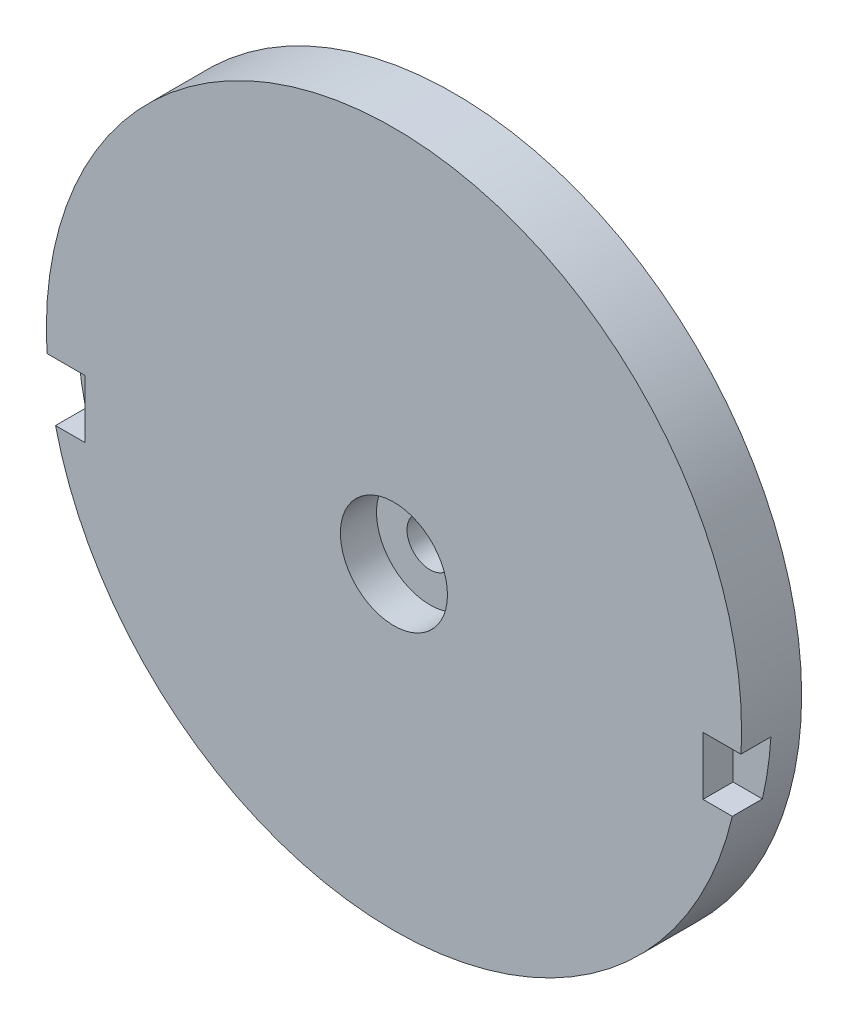
ISO-10303-21;
HEADER;
FILE_DESCRIPTION(('STEP AP214'),'2;1');
FILE_NAME('part.step','',(''),(''),'','','');
FILE_SCHEMA(('AUTOMOTIVE_DESIGN { 1 0 10303 214 1 1 1 1 }'));
ENDSEC;
DATA;
#1=APPLICATION_CONTEXT('core data for automotive mechanical design processes');
#2=APPLICATION_PROTOCOL_DEFINITION('international standard','automotive_design',2000,#1);
#3=PRODUCT_CONTEXT('',#1,'mechanical');
#4=PRODUCT('Part','Part','',(#3));
#5=PRODUCT_RELATED_PRODUCT_CATEGORY('part','',(#4));
#6=PRODUCT_DEFINITION_FORMATION('','',#4);
#7=PRODUCT_DEFINITION_CONTEXT('part definition',#1,'design');
#8=PRODUCT_DEFINITION('design','',#6,#7);
#9=PRODUCT_DEFINITION_SHAPE('','',#8);
#10=(LENGTH_UNIT() NAMED_UNIT(*) SI_UNIT(.MILLI.,.METRE.));
#11=(NAMED_UNIT(*) PLANE_ANGLE_UNIT() SI_UNIT($,.RADIAN.));
#12=(NAMED_UNIT(*) SI_UNIT($,.STERADIAN.) SOLID_ANGLE_UNIT());
#13=UNCERTAINTY_MEASURE_WITH_UNIT(LENGTH_MEASURE(1.E-05),#10,'distance_accuracy_value','');
#14=(GEOMETRIC_REPRESENTATION_CONTEXT(3) GLOBAL_UNCERTAINTY_ASSIGNED_CONTEXT((#13)) GLOBAL_UNIT_ASSIGNED_CONTEXT((#10,
#11,#12)) REPRESENTATION_CONTEXT('',''));
#15=CARTESIAN_POINT('',(0.,0.,0.));
#16=DIRECTION('',(0.,0.,1.));
#17=DIRECTION('',(1.,0.,0.));
#18=AXIS2_PLACEMENT_3D('',#15,#16,#17);
#19=CARTESIAN_POINT('',(0.,0.,-12.7));
#20=DIRECTION('',(0.,0.,1.));
#21=DIRECTION('',(1.,0.,0.));
#22=AXIS2_PLACEMENT_3D('',#19,#20,#21);
#23=CYLINDRICAL_SURFACE('',#22,73.406);
#24=DIRECTION('',(0.,0.,1.));
#25=VECTOR('',#24,1.);
#26=CARTESIAN_POINT('',(-71.4661398146003,-16.764,-6.35));
#27=LINE('',#26,#25);
#28=CARTESIAN_POINT('',(-71.4661398146003,-16.764,-6.35));
#29=VERTEX_POINT('',#28);
#30=CARTESIAN_POINT('',(-71.4661398146003,-16.764,0.));
#31=VERTEX_POINT('',#30);
#32=EDGE_CURVE('E138',#29,#31,#27,.T.);
#33=ORIENTED_EDGE('',*,*,#32,.F.);
#34=CARTESIAN_POINT('',(0.,0.,-6.35));
#35=DIRECTION('',(0.,0.,1.));
#36=DIRECTION('',(1.,0.,0.));
#37=AXIS2_PLACEMENT_3D('',#34,#35,#36);
#38=CIRCLE('',#37,73.406);
#39=CARTESIAN_POINT('',(-73.2681964999822,-4.4958,-6.35));
#40=VERTEX_POINT('',#39);
#41=EDGE_CURVE('E111',#40,#29,#38,.T.);
#42=ORIENTED_EDGE('',*,*,#41,.F.);
#43=DIRECTION('',(0.,0.,1.));
#44=VECTOR('',#43,1.);
#45=CARTESIAN_POINT('',(-73.2681964999822,-4.4958,-6.35));
#46=LINE('',#45,#44);
#47=CARTESIAN_POINT('',(-73.2681964999822,-4.4958,0.));
#48=VERTEX_POINT('',#47);
#49=EDGE_CURVE('E141',#40,#48,#46,.T.);
#50=ORIENTED_EDGE('',*,*,#49,.T.);
#51=CARTESIAN_POINT('',(0.,0.,0.));
#52=DIRECTION('',(0.,0.,1.));
#53=DIRECTION('',(1.,0.,0.));
#54=AXIS2_PLACEMENT_3D('',#51,#52,#53);
#55=CIRCLE('',#54,73.406);
#56=CARTESIAN_POINT('',(73.2681964999822,-4.4958,0.));
#57=VERTEX_POINT('',#56);
#58=EDGE_CURVE('E140',#57,#48,#55,.T.);
#59=ORIENTED_EDGE('',*,*,#58,.F.);
#60=DIRECTION('',(0.,0.,1.));
#61=VECTOR('',#60,1.);
#62=CARTESIAN_POINT('',(73.2681964999822,-4.4958,-6.35));
#63=LINE('',#62,#61);
#64=CARTESIAN_POINT('',(73.2681964999822,-4.4958,-6.35));
#65=VERTEX_POINT('',#64);
#66=EDGE_CURVE('E61',#65,#57,#63,.T.);
#67=ORIENTED_EDGE('',*,*,#66,.F.);
#68=CARTESIAN_POINT('',(0.,0.,-6.35));
#69=DIRECTION('',(0.,0.,1.));
#70=DIRECTION('',(1.,0.,0.));
#71=AXIS2_PLACEMENT_3D('',#68,#69,#70);
#72=CIRCLE('',#71,73.406);
#73=CARTESIAN_POINT('',(71.4661398146003,-16.764,-6.35));
#74=VERTEX_POINT('',#73);
#75=EDGE_CURVE('E148',#74,#65,#72,.T.);
#76=ORIENTED_EDGE('',*,*,#75,.F.);
#77=DIRECTION('',(0.,0.,1.));
#78=VECTOR('',#77,1.);
#79=CARTESIAN_POINT('',(71.4661398146003,-16.764,-6.35));
#80=LINE('',#79,#78);
#81=CARTESIAN_POINT('',(71.4661398146003,-16.764,0.));
#82=VERTEX_POINT('',#81);
#83=EDGE_CURVE('E157',#74,#82,#80,.T.);
#84=ORIENTED_EDGE('',*,*,#83,.T.);
#85=EDGE_CURVE('E45',#31,#82,#55,.T.);
#86=ORIENTED_EDGE('',*,*,#85,.F.);
#87=EDGE_LOOP('',(#33,#42,#50,#59,#67,#76,#84,#86));
#88=FACE_BOUND('',#87,.T.);
#89=CARTESIAN_POINT('',(0.,0.,-12.7));
#90=DIRECTION('',(0.,0.,1.));
#91=DIRECTION('',(1.,0.,0.));
#92=AXIS2_PLACEMENT_3D('',#89,#90,#91);
#93=CIRCLE('',#92,73.406);
#94=CARTESIAN_POINT('',(73.406,0.,-12.7));
#95=VERTEX_POINT('',#94);
#96=EDGE_CURVE('E11',#95,#95,#93,.T.);
#97=ORIENTED_EDGE('',*,*,#96,.T.);
#98=EDGE_LOOP('',(#97));
#99=FACE_BOUND('',#98,.T.);
#100=ADVANCED_FACE('F37',(#88,#99),#23,.T.);
#101=CARTESIAN_POINT('',(0.,0.,0.));
#102=DIRECTION('',(0.,0.,1.));
#103=DIRECTION('',(1.,0.,0.));
#104=AXIS2_PLACEMENT_3D('',#101,#102,#103);
#105=PLANE('',#104);
#106=CARTESIAN_POINT('',(0.,-6.35,0.));
#107=DIRECTION('',(0.,0.,1.));
#108=DIRECTION('',(1.,0.,0.));
#109=AXIS2_PLACEMENT_3D('',#106,#107,#108);
#110=CIRCLE('',#109,11.303);
#111=CARTESIAN_POINT('',(11.303,-6.35,0.));
#112=VERTEX_POINT('',#111);
#113=EDGE_CURVE('E130',#112,#112,#110,.T.);
#114=ORIENTED_EDGE('',*,*,#113,.F.);
#115=EDGE_LOOP('',(#114));
#116=FACE_BOUND('',#115,.T.);
#117=DIRECTION('',(1.,0.,0.));
#118=VECTOR('',#117,1.);
#119=CARTESIAN_POINT('',(0.,-16.764,0.));
#120=LINE('',#119,#118);
#121=CARTESIAN_POINT('',(-65.2685398146003,-16.764,0.));
#122=VERTEX_POINT('',#121);
#123=EDGE_CURVE('E53',#31,#122,#120,.T.);
#124=ORIENTED_EDGE('',*,*,#123,.F.);
#125=ORIENTED_EDGE('',*,*,#85,.T.);
#126=DIRECTION('',(-1.,0.,0.));
#127=VECTOR('',#126,1.);
#128=CARTESIAN_POINT('',(0.,-16.7639999999998,0.));
#129=LINE('',#128,#127);
#130=CARTESIAN_POINT('',(65.2685398146003,-16.764,0.));
#131=VERTEX_POINT('',#130);
#132=EDGE_CURVE('E158',#82,#131,#129,.T.);
#133=ORIENTED_EDGE('',*,*,#132,.T.);
#134=DIRECTION('',(0.,1.,0.));
#135=VECTOR('',#134,1.);
#136=CARTESIAN_POINT('',(65.2685398146003,0.,0.));
#137=LINE('',#136,#135);
#138=CARTESIAN_POINT('',(65.2685398146003,-4.49579999999998,0.));
#139=VERTEX_POINT('',#138);
#140=EDGE_CURVE('E149',#131,#139,#137,.T.);
#141=ORIENTED_EDGE('',*,*,#140,.T.);
#142=DIRECTION('',(-1.,0.,0.));
#143=VECTOR('',#142,1.);
#144=CARTESIAN_POINT('',(0.,-4.4958,0.));
#145=LINE('',#144,#143);
#146=EDGE_CURVE('E161',#57,#139,#145,.T.);
#147=ORIENTED_EDGE('',*,*,#146,.F.);
#148=ORIENTED_EDGE('',*,*,#58,.T.);
#149=DIRECTION('',(1.,0.,0.));
#150=VECTOR('',#149,1.);
#151=CARTESIAN_POINT('',(0.,-4.4958,0.));
#152=LINE('',#151,#150);
#153=CARTESIAN_POINT('',(-65.2685398146003,-4.4958,0.));
#154=VERTEX_POINT('',#153);
#155=EDGE_CURVE('E124',#48,#154,#152,.T.);
#156=ORIENTED_EDGE('',*,*,#155,.T.);
#157=DIRECTION('',(0.,1.,0.));
#158=VECTOR('',#157,1.);
#159=CARTESIAN_POINT('',(-65.2685398146003,0.,0.));
#160=LINE('',#159,#158);
#161=EDGE_CURVE('E127',#122,#154,#160,.T.);
#162=ORIENTED_EDGE('',*,*,#161,.F.);
#163=EDGE_LOOP('',(#124,#125,#133,#141,#147,#148,#156,#162));
#164=FACE_BOUND('',#163,.T.);
#165=ADVANCED_FACE('F177',(#116,#164),#105,.T.);
#166=CARTESIAN_POINT('',(0.,0.,-12.7));
#167=DIRECTION('',(0.,0.,1.));
#168=DIRECTION('',(1.,0.,0.));
#169=AXIS2_PLACEMENT_3D('',#166,#167,#168);
#170=PLANE('',#169);
#171=CARTESIAN_POINT('',(0.,-6.35,-12.7));
#172=DIRECTION('',(0.,0.,1.));
#173=DIRECTION('',(1.,0.,0.));
#174=AXIS2_PLACEMENT_3D('',#171,#172,#173);
#175=CIRCLE('',#174,4.8641);
#176=CARTESIAN_POINT('',(4.8641,-6.35,-12.7));
#177=VERTEX_POINT('',#176);
#178=EDGE_CURVE('E300',#177,#177,#175,.T.);
#179=ORIENTED_EDGE('',*,*,#178,.T.);
#180=EDGE_LOOP('',(#179));
#181=FACE_BOUND('',#180,.T.);
#182=ORIENTED_EDGE('',*,*,#96,.F.);
#183=EDGE_LOOP('',(#182));
#184=FACE_BOUND('',#183,.T.);
#185=ADVANCED_FACE('F206',(#181,#184),#170,.F.);
#186=CARTESIAN_POINT('',(0.,-16.7639999999998,-6.35));
#187=DIRECTION('',(0.,1.,0.));
#188=DIRECTION('',(-1.,0.,0.));
#189=AXIS2_PLACEMENT_3D('',#186,#187,#188);
#190=PLANE('',#189);
#191=ORIENTED_EDGE('',*,*,#132,.F.);
#192=ORIENTED_EDGE('',*,*,#83,.F.);
#193=DIRECTION('',(-1.,0.,0.));
#194=VECTOR('',#193,1.);
#195=CARTESIAN_POINT('',(0.,-16.7639999999998,-6.35));
#196=LINE('',#195,#194);
#197=CARTESIAN_POINT('',(65.2685398146003,-16.764,-6.35));
#198=VERTEX_POINT('',#197);
#199=EDGE_CURVE('E145',#74,#198,#196,.T.);
#200=ORIENTED_EDGE('',*,*,#199,.T.);
#201=DIRECTION('',(0.,0.,1.));
#202=VECTOR('',#201,1.);
#203=CARTESIAN_POINT('',(65.2685398146003,-16.764,-6.35));
#204=LINE('',#203,#202);
#205=EDGE_CURVE('E136',#198,#131,#204,.T.);
#206=ORIENTED_EDGE('',*,*,#205,.T.);
#207=EDGE_LOOP('',(#191,#192,#200,#206));
#208=FACE_BOUND('',#207,.T.);
#209=ADVANCED_FACE('F183',(#208),#190,.T.);
#210=CARTESIAN_POINT('',(65.2685398146003,0.,-6.35));
#211=DIRECTION('',(1.,0.,0.));
#212=DIRECTION('',(0.,0.,-1.));
#213=AXIS2_PLACEMENT_3D('',#210,#211,#212);
#214=PLANE('',#213);
#215=ORIENTED_EDGE('',*,*,#140,.F.);
#216=ORIENTED_EDGE('',*,*,#205,.F.);
#217=DIRECTION('',(0.,1.,0.));
#218=VECTOR('',#217,1.);
#219=CARTESIAN_POINT('',(65.2685398146003,0.,-6.35));
#220=LINE('',#219,#218);
#221=CARTESIAN_POINT('',(65.2685398146003,-4.49579999999998,-6.35));
#222=VERTEX_POINT('',#221);
#223=EDGE_CURVE('E155',#198,#222,#220,.T.);
#224=ORIENTED_EDGE('',*,*,#223,.T.);
#225=DIRECTION('',(0.,0.,1.));
#226=VECTOR('',#225,1.);
#227=CARTESIAN_POINT('',(65.2685398146003,-4.49579999999998,-6.35));
#228=LINE('',#227,#226);
#229=EDGE_CURVE('E168',#222,#139,#228,.T.);
#230=ORIENTED_EDGE('',*,*,#229,.T.);
#231=EDGE_LOOP('',(#215,#216,#224,#230));
#232=FACE_BOUND('',#231,.T.);
#233=ADVANCED_FACE('F189',(#232),#214,.T.);
#234=CARTESIAN_POINT('',(0.,-4.4958,-6.35));
#235=DIRECTION('',(0.,1.,0.));
#236=DIRECTION('',(0.,0.,1.));
#237=AXIS2_PLACEMENT_3D('',#234,#235,#236);
#238=PLANE('',#237);
#239=ORIENTED_EDGE('',*,*,#146,.T.);
#240=ORIENTED_EDGE('',*,*,#229,.F.);
#241=DIRECTION('',(-1.,0.,0.));
#242=VECTOR('',#241,1.);
#243=CARTESIAN_POINT('',(0.,-4.4958,-6.35));
#244=LINE('',#243,#242);
#245=EDGE_CURVE('E152',#65,#222,#244,.T.);
#246=ORIENTED_EDGE('',*,*,#245,.F.);
#247=ORIENTED_EDGE('',*,*,#66,.T.);
#248=EDGE_LOOP('',(#239,#240,#246,#247));
#249=FACE_BOUND('',#248,.T.);
#250=ADVANCED_FACE('F190',(#249),#238,.F.);
#251=CARTESIAN_POINT('',(0.,0.,-6.35));
#252=DIRECTION('',(0.,0.,1.));
#253=DIRECTION('',(1.,0.,0.));
#254=AXIS2_PLACEMENT_3D('',#251,#252,#253);
#255=PLANE('',#254);
#256=ORIENTED_EDGE('',*,*,#199,.F.);
#257=ORIENTED_EDGE('',*,*,#75,.T.);
#258=ORIENTED_EDGE('',*,*,#245,.T.);
#259=ORIENTED_EDGE('',*,*,#223,.F.);
#260=EDGE_LOOP('',(#256,#257,#258,#259));
#261=FACE_BOUND('',#260,.T.);
#262=ADVANCED_FACE('F186',(#261),#255,.T.);
#263=CARTESIAN_POINT('',(0.,-16.764,-6.35));
#264=DIRECTION('',(0.,-1.,0.));
#265=DIRECTION('',(0.,0.,-1.));
#266=AXIS2_PLACEMENT_3D('',#263,#264,#265);
#267=PLANE('',#266);
#268=ORIENTED_EDGE('',*,*,#123,.T.);
#269=DIRECTION('',(0.,0.,1.));
#270=VECTOR('',#269,1.);
#271=CARTESIAN_POINT('',(-65.2685398146003,-16.764,-6.35));
#272=LINE('',#271,#270);
#273=CARTESIAN_POINT('',(-65.2685398146003,-16.764,-6.35));
#274=VERTEX_POINT('',#273);
#275=EDGE_CURVE('E101',#274,#122,#272,.T.);
#276=ORIENTED_EDGE('',*,*,#275,.F.);
#277=DIRECTION('',(1.,0.,0.));
#278=VECTOR('',#277,1.);
#279=CARTESIAN_POINT('',(0.,-16.764,-6.35));
#280=LINE('',#279,#278);
#281=EDGE_CURVE('E105',#29,#274,#280,.T.);
#282=ORIENTED_EDGE('',*,*,#281,.F.);
#283=ORIENTED_EDGE('',*,*,#32,.T.);
#284=EDGE_LOOP('',(#268,#276,#282,#283));
#285=FACE_BOUND('',#284,.T.);
#286=ADVANCED_FACE('F103',(#285),#267,.F.);
#287=CARTESIAN_POINT('',(0.,-4.4958,-6.35));
#288=DIRECTION('',(0.,-1.,0.));
#289=DIRECTION('',(0.,0.,-1.));
#290=AXIS2_PLACEMENT_3D('',#287,#288,#289);
#291=PLANE('',#290);
#292=ORIENTED_EDGE('',*,*,#155,.F.);
#293=ORIENTED_EDGE('',*,*,#49,.F.);
#294=DIRECTION('',(1.,0.,0.));
#295=VECTOR('',#294,1.);
#296=CARTESIAN_POINT('',(0.,-4.4958,-6.35));
#297=LINE('',#296,#295);
#298=CARTESIAN_POINT('',(-65.2685398146003,-4.4958,-6.35));
#299=VERTEX_POINT('',#298);
#300=EDGE_CURVE('E119',#40,#299,#297,.T.);
#301=ORIENTED_EDGE('',*,*,#300,.T.);
#302=DIRECTION('',(0.,0.,1.));
#303=VECTOR('',#302,1.);
#304=CARTESIAN_POINT('',(-65.2685398146003,-4.4958,-6.35));
#305=LINE('',#304,#303);
#306=EDGE_CURVE('E110',#299,#154,#305,.T.);
#307=ORIENTED_EDGE('',*,*,#306,.T.);
#308=EDGE_LOOP('',(#292,#293,#301,#307));
#309=FACE_BOUND('',#308,.T.);
#310=ADVANCED_FACE('F192',(#309),#291,.T.);
#311=CARTESIAN_POINT('',(-65.2685398146003,0.,-6.35));
#312=DIRECTION('',(1.,0.,0.));
#313=DIRECTION('',(0.,0.,-1.));
#314=AXIS2_PLACEMENT_3D('',#311,#312,#313);
#315=PLANE('',#314);
#316=ORIENTED_EDGE('',*,*,#161,.T.);
#317=ORIENTED_EDGE('',*,*,#306,.F.);
#318=DIRECTION('',(0.,1.,0.));
#319=VECTOR('',#318,1.);
#320=CARTESIAN_POINT('',(-65.2685398146003,0.,-6.35));
#321=LINE('',#320,#319);
#322=EDGE_CURVE('E115',#274,#299,#321,.T.);
#323=ORIENTED_EDGE('',*,*,#322,.F.);
#324=ORIENTED_EDGE('',*,*,#275,.T.);
#325=EDGE_LOOP('',(#316,#317,#323,#324));
#326=FACE_BOUND('',#325,.T.);
#327=ADVANCED_FACE('F116',(#326),#315,.F.);
#328=CARTESIAN_POINT('',(0.,0.,-6.35));
#329=DIRECTION('',(0.,0.,1.));
#330=DIRECTION('',(1.,0.,0.));
#331=AXIS2_PLACEMENT_3D('',#328,#329,#330);
#332=PLANE('',#331);
#333=ORIENTED_EDGE('',*,*,#281,.T.);
#334=ORIENTED_EDGE('',*,*,#322,.T.);
#335=ORIENTED_EDGE('',*,*,#300,.F.);
#336=ORIENTED_EDGE('',*,*,#41,.T.);
#337=EDGE_LOOP('',(#333,#334,#335,#336));
#338=FACE_BOUND('',#337,.T.);
#339=ADVANCED_FACE('F121',(#338),#332,.T.);
#340=CARTESIAN_POINT('',(0.,-6.35,-7.62));
#341=DIRECTION('',(0.,0.,1.));
#342=DIRECTION('',(1.,0.,0.));
#343=AXIS2_PLACEMENT_3D('',#340,#341,#342);
#344=CYLINDRICAL_SURFACE('',#343,11.303);
#345=CARTESIAN_POINT('',(0.,-6.35,-7.62));
#346=DIRECTION('',(0.,0.,1.));
#347=DIRECTION('',(1.,0.,0.));
#348=AXIS2_PLACEMENT_3D('',#345,#346,#347);
#349=CIRCLE('',#348,11.303);
#350=CARTESIAN_POINT('',(11.303,-6.35,-7.62));
#351=VERTEX_POINT('',#350);
#352=EDGE_CURVE('E162',#351,#351,#349,.T.);
#353=CARTESIAN_POINT('',(11.303,-6.35,-7.62));
#354=CARTESIAN_POINT('',(11.303,-6.35,-7.540625));
#355=CARTESIAN_POINT('',(11.303,-6.35,-7.46125));
#356=CARTESIAN_POINT('',(11.303,-6.35,-7.3025));
#357=CARTESIAN_POINT('',(11.303,-6.35,-7.223125));
#358=CARTESIAN_POINT('',(11.303,-6.35,-7.064375));
#359=CARTESIAN_POINT('',(11.303,-6.35,-6.985));
#360=CARTESIAN_POINT('',(11.303,-6.35,-6.82625));
#361=CARTESIAN_POINT('',(11.303,-6.35,-6.746875));
#362=CARTESIAN_POINT('',(11.303,-6.35,-6.588125));
#363=CARTESIAN_POINT('',(11.303,-6.35,-6.50875));
#364=CARTESIAN_POINT('',(11.303,-6.35,-6.35));
#365=CARTESIAN_POINT('',(11.303,-6.35,-6.270625));
#366=CARTESIAN_POINT('',(11.303,-6.35,-6.111875));
#367=CARTESIAN_POINT('',(11.303,-6.35,-6.0325));
#368=CARTESIAN_POINT('',(11.303,-6.35,-5.87375));
#369=CARTESIAN_POINT('',(11.303,-6.35,-5.794375));
#370=CARTESIAN_POINT('',(11.303,-6.35,-5.635625));
#371=CARTESIAN_POINT('',(11.303,-6.35,-5.55625));
#372=CARTESIAN_POINT('',(11.303,-6.35,-5.3975));
#373=CARTESIAN_POINT('',(11.303,-6.35,-5.318125));
#374=CARTESIAN_POINT('',(11.303,-6.35,-5.159375));
#375=CARTESIAN_POINT('',(11.303,-6.35,-5.08));
#376=CARTESIAN_POINT('',(11.303,-6.35,-4.92125));
#377=CARTESIAN_POINT('',(11.303,-6.35,-4.841875));
#378=CARTESIAN_POINT('',(11.303,-6.35,-4.683125));
#379=CARTESIAN_POINT('',(11.303,-6.35,-4.60375));
#380=CARTESIAN_POINT('',(11.303,-6.35,-4.445));
#381=CARTESIAN_POINT('',(11.303,-6.35,-4.365625));
#382=CARTESIAN_POINT('',(11.303,-6.35,-4.206875));
#383=CARTESIAN_POINT('',(11.303,-6.35,-4.1275));
#384=CARTESIAN_POINT('',(11.303,-6.35,-3.96875));
#385=CARTESIAN_POINT('',(11.303,-6.35,-3.889375));
#386=CARTESIAN_POINT('',(11.303,-6.35,-3.730625));
#387=CARTESIAN_POINT('',(11.303,-6.35,-3.65125));
#388=CARTESIAN_POINT('',(11.303,-6.35,-3.4925));
#389=CARTESIAN_POINT('',(11.303,-6.35,-3.413125));
#390=CARTESIAN_POINT('',(11.303,-6.35,-3.254375));
#391=CARTESIAN_POINT('',(11.303,-6.35,-3.175));
#392=CARTESIAN_POINT('',(11.303,-6.35,-3.01625));
#393=CARTESIAN_POINT('',(11.303,-6.35,-2.936875));
#394=CARTESIAN_POINT('',(11.303,-6.35,-2.778125));
#395=CARTESIAN_POINT('',(11.303,-6.35,-2.69875));
#396=CARTESIAN_POINT('',(11.303,-6.35,-2.54));
#397=CARTESIAN_POINT('',(11.303,-6.35,-2.460625));
#398=CARTESIAN_POINT('',(11.303,-6.35,-2.301875));
#399=CARTESIAN_POINT('',(11.303,-6.35,-2.2225));
#400=CARTESIAN_POINT('',(11.303,-6.35,-2.06375));
#401=CARTESIAN_POINT('',(11.303,-6.35,-1.984375));
#402=CARTESIAN_POINT('',(11.303,-6.35,-1.825625));
#403=CARTESIAN_POINT('',(11.303,-6.35,-1.74625));
#404=CARTESIAN_POINT('',(11.303,-6.35,-1.5875));
#405=CARTESIAN_POINT('',(11.303,-6.35,-1.508125));
#406=CARTESIAN_POINT('',(11.303,-6.35,-1.349375));
#407=CARTESIAN_POINT('',(11.303,-6.35,-1.27));
#408=CARTESIAN_POINT('',(11.303,-6.35,-1.11125));
#409=CARTESIAN_POINT('',(11.303,-6.35,-1.031875));
#410=CARTESIAN_POINT('',(11.303,-6.35,-0.873125));
#411=CARTESIAN_POINT('',(11.303,-6.35,-0.79375));
#412=CARTESIAN_POINT('',(11.303,-6.35,-0.635));
#413=CARTESIAN_POINT('',(11.303,-6.35,-0.555625));
#414=CARTESIAN_POINT('',(11.303,-6.35,-0.396875));
#415=CARTESIAN_POINT('',(11.303,-6.35,-0.3175));
#416=CARTESIAN_POINT('',(11.303,-6.35,-0.15875));
#417=CARTESIAN_POINT('',(11.303,-6.35,-0.0793749999999999));
#418=CARTESIAN_POINT('',(11.303,-6.35,0.));
#419=B_SPLINE_CURVE_WITH_KNOTS('',3,(#353,#354,#355,#356,#357,#358,#359,#360,#361,#362,#363,
#364,#365,#366,#367,#368,#369,#370,#371,#372,#373,#374,#375,#376,#377,#378,#379,#380,#381,#382,
#383,#384,#385,#386,#387,#388,#389,#390,#391,#392,#393,#394,#395,#396,#397,#398,#399,#400,#401,
#402,#403,#404,#405,#406,#407,#408,#409,#410,#411,#412,#413,#414,#415,#416,#417,#418),
.UNSPECIFIED.,.F.,.F.,(4,2,2,2,2,2,2,2,2,2,2,2,2,2,2,2,2,2,2,2,2,2,2,2,2,2,2,2,2,2,2,2,4),(0.,
0.238125,0.476249999999999,0.714375,0.952499999999999,1.190625,1.42875,1.666875,1.905,2.143125,
2.38125,2.619375,2.8575,3.095625,3.33375,3.571875,3.81,4.048125,4.28625,4.524375,4.7625,
5.000625,5.23875,5.476875,5.715,5.953125,6.19125,6.429375,6.6675,6.905625,7.14375,7.381875,
7.62),.UNSPECIFIED.);
#420=EDGE_CURVE('BSEAM251',#351,#112,#419,.T.);
#421=ORIENTED_EDGE('',*,*,#352,.F.);
#422=ORIENTED_EDGE('',*,*,#113,.T.);
#423=ORIENTED_EDGE('',*,*,#420,.T.);
#424=ORIENTED_EDGE('',*,*,#420,.F.);
#425=EDGE_LOOP('',(#421,#423,#422,#424));
#426=FACE_BOUND('',#425,.T.);
#427=ADVANCED_FACE('F251',(#426),#344,.F.);
#428=CARTESIAN_POINT('',(0.,-6.35,-7.62));
#429=DIRECTION('',(0.,0.,1.));
#430=DIRECTION('',(1.,0.,0.));
#431=AXIS2_PLACEMENT_3D('',#428,#429,#430);
#432=PLANE('',#431);
#433=CARTESIAN_POINT('',(0.,-6.35,-7.62));
#434=DIRECTION('',(0.,0.,1.));
#435=DIRECTION('',(1.,0.,0.));
#436=AXIS2_PLACEMENT_3D('',#433,#434,#435);
#437=CIRCLE('',#436,4.8641);
#438=CARTESIAN_POINT('',(4.8641,-6.35,-7.62));
#439=VERTEX_POINT('',#438);
#440=EDGE_CURVE('E40',#439,#439,#437,.T.);
#441=ORIENTED_EDGE('',*,*,#440,.F.);
#442=EDGE_LOOP('',(#441));
#443=FACE_BOUND('',#442,.T.);
#444=ORIENTED_EDGE('',*,*,#352,.T.);
#445=EDGE_LOOP('',(#444));
#446=FACE_BOUND('',#445,.T.);
#447=ADVANCED_FACE('F266',(#443,#446),#432,.T.);
#448=CARTESIAN_POINT('',(0.,-6.35,-12.7));
#449=DIRECTION('',(0.,0.,1.));
#450=DIRECTION('',(1.,0.,0.));
#451=AXIS2_PLACEMENT_3D('',#448,#449,#450);
#452=CYLINDRICAL_SURFACE('',#451,4.8641);
#453=ORIENTED_EDGE('',*,*,#440,.T.);
#454=EDGE_LOOP('',(#453));
#455=FACE_BOUND('',#454,.T.);
#456=ORIENTED_EDGE('',*,*,#178,.F.);
#457=EDGE_LOOP('',(#456));
#458=FACE_BOUND('',#457,.T.);
#459=ADVANCED_FACE('F281',(#455,#458),#452,.F.);
#460=CLOSED_SHELL('',(#100,#165,#185,#209,#233,#250,#262,#286,#310,#327,#339,#427,#447,#459));
#461=MANIFOLD_SOLID_BREP('B2',#460);
#462=ADVANCED_BREP_SHAPE_REPRESENTATION('',(#18,#461),#14);
#463=SHAPE_DEFINITION_REPRESENTATION(#9,#462);
ENDSEC;
END-ISO-10303-21;
